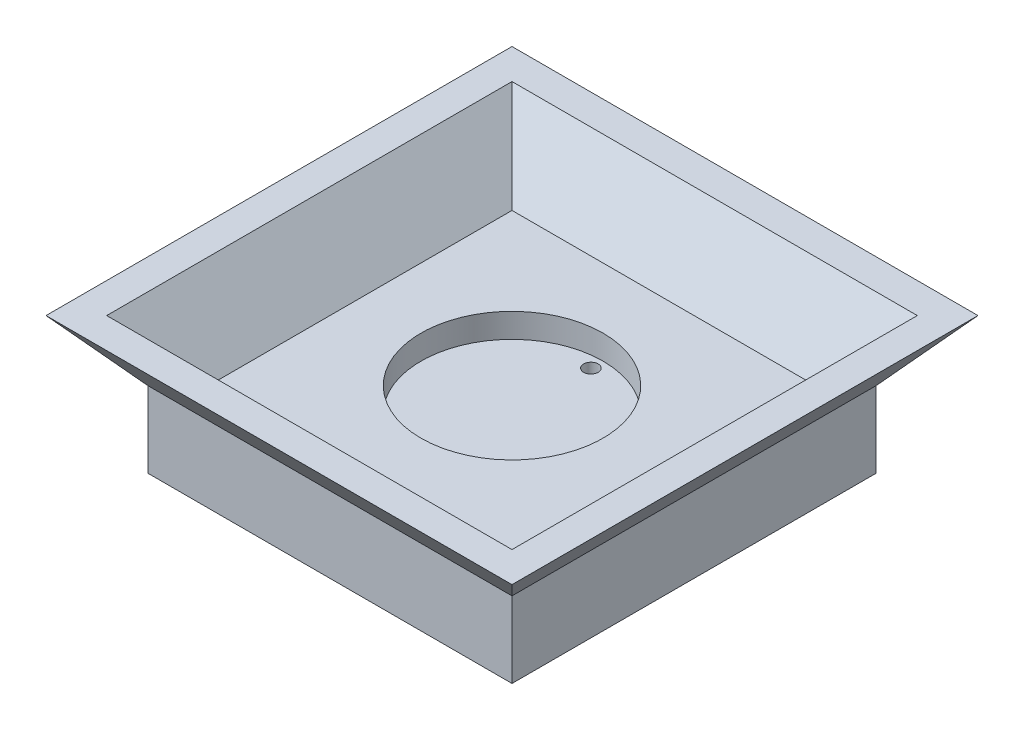
ISO-10303-21;
HEADER;
FILE_DESCRIPTION(('STEP AP214'),'2;1');
FILE_NAME('part.step','',(''),(''),'','','');
FILE_SCHEMA(('AUTOMOTIVE_DESIGN { 1 0 10303 214 1 1 1 1 }'));
ENDSEC;
DATA;
#1=APPLICATION_CONTEXT('core data for automotive mechanical design processes');
#2=APPLICATION_PROTOCOL_DEFINITION('international standard','automotive_design',2000,#1);
#3=PRODUCT_CONTEXT('',#1,'mechanical');
#4=PRODUCT('Part','Part','',(#3));
#5=PRODUCT_RELATED_PRODUCT_CATEGORY('part','',(#4));
#6=PRODUCT_DEFINITION_FORMATION('','',#4);
#7=PRODUCT_DEFINITION_CONTEXT('part definition',#1,'design');
#8=PRODUCT_DEFINITION('design','',#6,#7);
#9=PRODUCT_DEFINITION_SHAPE('','',#8);
#10=(LENGTH_UNIT() NAMED_UNIT(*) SI_UNIT(.MILLI.,.METRE.));
#11=(NAMED_UNIT(*) PLANE_ANGLE_UNIT() SI_UNIT($,.RADIAN.));
#12=(NAMED_UNIT(*) SI_UNIT($,.STERADIAN.) SOLID_ANGLE_UNIT());
#13=UNCERTAINTY_MEASURE_WITH_UNIT(LENGTH_MEASURE(1.E-05),#10,'distance_accuracy_value','');
#14=(GEOMETRIC_REPRESENTATION_CONTEXT(3) GLOBAL_UNCERTAINTY_ASSIGNED_CONTEXT((#13)) GLOBAL_UNIT_ASSIGNED_CONTEXT((#10,
#11,#12)) REPRESENTATION_CONTEXT('',''));
#15=CARTESIAN_POINT('',(0.,0.,0.));
#16=DIRECTION('',(0.,0.,1.));
#17=DIRECTION('',(1.,0.,0.));
#18=AXIS2_PLACEMENT_3D('',#15,#16,#17);
#19=CARTESIAN_POINT('',(38.1,15.875,38.1));
#20=DIRECTION('',(-1.,0.,0.));
#21=DIRECTION('',(0.,0.,1.));
#22=AXIS2_PLACEMENT_3D('',#19,#20,#21);
#23=PLANE('',#22);
#24=DIRECTION('',(0.,-1.,0.));
#25=VECTOR('',#24,1.);
#26=CARTESIAN_POINT('',(38.1,15.875,38.1));
#27=LINE('',#26,#25);
#28=CARTESIAN_POINT('',(38.1,15.875,38.1));
#29=VERTEX_POINT('',#28);
#30=CARTESIAN_POINT('',(38.1,0.,38.1));
#31=VERTEX_POINT('',#30);
#32=EDGE_CURVE('E130',#29,#31,#27,.T.);
#33=ORIENTED_EDGE('',*,*,#32,.T.);
#34=DIRECTION('',(0.,0.,1.));
#35=VECTOR('',#34,1.);
#36=CARTESIAN_POINT('',(38.1,0.,0.));
#37=LINE('',#36,#35);
#38=CARTESIAN_POINT('',(38.1,0.,-38.1));
#39=VERTEX_POINT('',#38);
#40=EDGE_CURVE('E47',#39,#31,#37,.T.);
#41=ORIENTED_EDGE('',*,*,#40,.F.);
#42=DIRECTION('',(0.,-1.,0.));
#43=VECTOR('',#42,1.);
#44=CARTESIAN_POINT('',(38.1,15.875,-38.1));
#45=LINE('',#44,#43);
#46=CARTESIAN_POINT('',(38.1,15.875,-38.1));
#47=VERTEX_POINT('',#46);
#48=EDGE_CURVE('E11',#47,#39,#45,.T.);
#49=ORIENTED_EDGE('',*,*,#48,.F.);
#50=DIRECTION('',(0.,0.,-1.));
#51=VECTOR('',#50,1.);
#52=CARTESIAN_POINT('',(38.1,15.875,38.1));
#53=LINE('',#52,#51);
#54=EDGE_CURVE('E141',#29,#47,#53,.T.);
#55=ORIENTED_EDGE('',*,*,#54,.F.);
#56=EDGE_LOOP('',(#33,#41,#49,#55));
#57=FACE_BOUND('',#56,.T.);
#58=ADVANCED_FACE('F33',(#57),#23,.F.);
#59=CARTESIAN_POINT('',(-38.1,15.875,-38.1));
#60=DIRECTION('',(0.,0.,1.));
#61=DIRECTION('',(1.,0.,0.));
#62=AXIS2_PLACEMENT_3D('',#59,#60,#61);
#63=PLANE('',#62);
#64=ORIENTED_EDGE('',*,*,#48,.T.);
#65=DIRECTION('',(1.,0.,0.));
#66=VECTOR('',#65,1.);
#67=CARTESIAN_POINT('',(0.,0.,-38.1));
#68=LINE('',#67,#66);
#69=CARTESIAN_POINT('',(-38.1,0.,-38.1));
#70=VERTEX_POINT('',#69);
#71=EDGE_CURVE('E124',#70,#39,#68,.T.);
#72=ORIENTED_EDGE('',*,*,#71,.F.);
#73=DIRECTION('',(0.,-1.,0.));
#74=VECTOR('',#73,1.);
#75=CARTESIAN_POINT('',(-38.1,15.875,-38.1));
#76=LINE('',#75,#74);
#77=CARTESIAN_POINT('',(-38.1,15.875,-38.1));
#78=VERTEX_POINT('',#77);
#79=EDGE_CURVE('E40',#78,#70,#76,.T.);
#80=ORIENTED_EDGE('',*,*,#79,.F.);
#81=DIRECTION('',(-1.,0.,0.));
#82=VECTOR('',#81,1.);
#83=CARTESIAN_POINT('',(-38.1,15.875,-38.1));
#84=LINE('',#83,#82);
#85=EDGE_CURVE('E138',#47,#78,#84,.T.);
#86=ORIENTED_EDGE('',*,*,#85,.F.);
#87=EDGE_LOOP('',(#64,#72,#80,#86));
#88=FACE_BOUND('',#87,.T.);
#89=ADVANCED_FACE('F266',(#88),#63,.F.);
#90=CARTESIAN_POINT('',(-38.1,15.875,38.1));
#91=DIRECTION('',(1.,0.,0.));
#92=DIRECTION('',(0.,0.,-1.));
#93=AXIS2_PLACEMENT_3D('',#90,#91,#92);
#94=PLANE('',#93);
#95=ORIENTED_EDGE('',*,*,#79,.T.);
#96=DIRECTION('',(0.,0.,-1.));
#97=VECTOR('',#96,1.);
#98=CARTESIAN_POINT('',(-38.1,0.,0.));
#99=LINE('',#98,#97);
#100=CARTESIAN_POINT('',(-38.1,0.,38.1));
#101=VERTEX_POINT('',#100);
#102=EDGE_CURVE('E110',#101,#70,#99,.T.);
#103=ORIENTED_EDGE('',*,*,#102,.F.);
#104=DIRECTION('',(0.,-1.,0.));
#105=VECTOR('',#104,1.);
#106=CARTESIAN_POINT('',(-38.1,15.875,38.1));
#107=LINE('',#106,#105);
#108=CARTESIAN_POINT('',(-38.1,15.875,38.1));
#109=VERTEX_POINT('',#108);
#110=EDGE_CURVE('E122',#109,#101,#107,.T.);
#111=ORIENTED_EDGE('',*,*,#110,.F.);
#112=DIRECTION('',(0.,0.,1.));
#113=VECTOR('',#112,1.);
#114=CARTESIAN_POINT('',(-38.1,15.875,38.1));
#115=LINE('',#114,#113);
#116=EDGE_CURVE('E135',#78,#109,#115,.T.);
#117=ORIENTED_EDGE('',*,*,#116,.F.);
#118=EDGE_LOOP('',(#95,#103,#111,#117));
#119=FACE_BOUND('',#118,.T.);
#120=ADVANCED_FACE('F120',(#119),#94,.F.);
#121=CARTESIAN_POINT('',(-38.1,15.875,38.1));
#122=DIRECTION('',(0.,0.,-1.));
#123=DIRECTION('',(-1.,0.,0.));
#124=AXIS2_PLACEMENT_3D('',#121,#122,#123);
#125=PLANE('',#124);
#126=ORIENTED_EDGE('',*,*,#110,.T.);
#127=DIRECTION('',(-1.,0.,0.));
#128=VECTOR('',#127,1.);
#129=CARTESIAN_POINT('',(0.,0.,38.1));
#130=LINE('',#129,#128);
#131=EDGE_CURVE('E106',#31,#101,#130,.T.);
#132=ORIENTED_EDGE('',*,*,#131,.F.);
#133=ORIENTED_EDGE('',*,*,#32,.F.);
#134=DIRECTION('',(1.,0.,0.));
#135=VECTOR('',#134,1.);
#136=CARTESIAN_POINT('',(-38.1,15.875,38.1));
#137=LINE('',#136,#135);
#138=EDGE_CURVE('E128',#109,#29,#137,.T.);
#139=ORIENTED_EDGE('',*,*,#138,.F.);
#140=EDGE_LOOP('',(#126,#132,#133,#139));
#141=FACE_BOUND('',#140,.T.);
#142=ADVANCED_FACE('F126',(#141),#125,.F.);
#143=CARTESIAN_POINT('',(-38.1,15.875,-38.1));
#144=DIRECTION('',(-0.766044443118977,-0.64278760968654,0.));
#145=DIRECTION('',(0.642787609686541,-0.766044443118977,0.));
#146=AXIS2_PLACEMENT_3D('',#143,#144,#145);
#147=PLANE('',#146);
#148=ORIENTED_EDGE('',*,*,#116,.T.);
#149=DIRECTION('',(0.540716203060937,-0.644400477571771,-0.540716203060937));
#150=VECTOR('',#149,1.);
#151=CARTESIAN_POINT('',(-38.1,15.875,38.1));
#152=LINE('',#151,#150);
#153=CARTESIAN_POINT('',(-48.7565653159515,28.575,48.7565653159515));
#154=VERTEX_POINT('',#153);
#155=EDGE_CURVE('E144',#154,#109,#152,.T.);
#156=ORIENTED_EDGE('',*,*,#155,.F.);
#157=DIRECTION('',(0.,0.,-1.));
#158=VECTOR('',#157,1.);
#159=CARTESIAN_POINT('',(-48.7565653159515,28.575,-38.1));
#160=LINE('',#159,#158);
#161=CARTESIAN_POINT('',(-48.7565653159515,28.575,-48.7565653159515));
#162=VERTEX_POINT('',#161);
#163=EDGE_CURVE('E152',#162,#154,#160,.F.);
#164=ORIENTED_EDGE('',*,*,#163,.F.);
#165=DIRECTION('',(0.540716203060937,-0.644400477571771,0.540716203060937));
#166=VECTOR('',#165,1.);
#167=CARTESIAN_POINT('',(-38.1,15.875,-38.1));
#168=LINE('',#167,#166);
#169=EDGE_CURVE('E147',#162,#78,#168,.T.);
#170=ORIENTED_EDGE('',*,*,#169,.T.);
#171=EDGE_LOOP('',(#148,#156,#164,#170));
#172=FACE_BOUND('',#171,.T.);
#173=ADVANCED_FACE('F256',(#172),#147,.T.);
#174=CARTESIAN_POINT('',(-38.1,15.875,38.1));
#175=DIRECTION('',(0.,-0.64278760968654,0.766044443118977));
#176=DIRECTION('',(0.,-0.766044443118977,-0.64278760968654));
#177=AXIS2_PLACEMENT_3D('',#174,#175,#176);
#178=PLANE('',#177);
#179=ORIENTED_EDGE('',*,*,#138,.T.);
#180=DIRECTION('',(-0.540716203060937,-0.644400477571771,-0.540716203060937));
#181=VECTOR('',#180,1.);
#182=CARTESIAN_POINT('',(15.821100266349,-10.6759587966246,15.8211002663491));
#183=LINE('',#182,#181);
#184=CARTESIAN_POINT('',(48.7565653159515,28.575,48.7565653159515));
#185=VERTEX_POINT('',#184);
#186=EDGE_CURVE('E156',#185,#29,#183,.T.);
#187=ORIENTED_EDGE('',*,*,#186,.F.);
#188=DIRECTION('',(-1.,0.,0.));
#189=VECTOR('',#188,1.);
#190=CARTESIAN_POINT('',(-38.1,28.575,48.7565653159515));
#191=LINE('',#190,#189);
#192=EDGE_CURVE('E150',#154,#185,#191,.F.);
#193=ORIENTED_EDGE('',*,*,#192,.F.);
#194=ORIENTED_EDGE('',*,*,#155,.T.);
#195=EDGE_LOOP('',(#179,#187,#193,#194));
#196=FACE_BOUND('',#195,.T.);
#197=ADVANCED_FACE('F258',(#196),#178,.T.);
#198=CARTESIAN_POINT('',(38.1,15.875,-38.1));
#199=DIRECTION('',(0.766044443118977,-0.64278760968654,0.));
#200=DIRECTION('',(0.642787609686541,0.766044443118977,0.));
#201=AXIS2_PLACEMENT_3D('',#198,#199,#200);
#202=PLANE('',#201);
#203=ORIENTED_EDGE('',*,*,#54,.T.);
#204=DIRECTION('',(-0.540716203060937,-0.644400477571771,0.540716203060937));
#205=VECTOR('',#204,1.);
#206=CARTESIAN_POINT('',(15.821100266349,-10.6759587966246,-15.8211002663491));
#207=LINE('',#206,#205);
#208=CARTESIAN_POINT('',(48.7565653159515,28.575,-48.7565653159515));
#209=VERTEX_POINT('',#208);
#210=EDGE_CURVE('E159',#209,#47,#207,.T.);
#211=ORIENTED_EDGE('',*,*,#210,.F.);
#212=DIRECTION('',(0.,0.,1.));
#213=VECTOR('',#212,1.);
#214=CARTESIAN_POINT('',(48.7565653159515,28.575,-38.1));
#215=LINE('',#214,#213);
#216=EDGE_CURVE('E148',#185,#209,#215,.F.);
#217=ORIENTED_EDGE('',*,*,#216,.F.);
#218=ORIENTED_EDGE('',*,*,#186,.T.);
#219=EDGE_LOOP('',(#203,#211,#217,#218));
#220=FACE_BOUND('',#219,.T.);
#221=ADVANCED_FACE('F262',(#220),#202,.T.);
#222=CARTESIAN_POINT('',(-38.1,15.875,-38.1));
#223=DIRECTION('',(0.,-0.64278760968654,-0.766044443118977));
#224=DIRECTION('',(0.,0.766044443118977,-0.64278760968654));
#225=AXIS2_PLACEMENT_3D('',#222,#223,#224);
#226=PLANE('',#225);
#227=ORIENTED_EDGE('',*,*,#85,.T.);
#228=ORIENTED_EDGE('',*,*,#169,.F.);
#229=DIRECTION('',(1.,0.,0.));
#230=VECTOR('',#229,1.);
#231=CARTESIAN_POINT('',(-38.1,28.575,-48.7565653159515));
#232=LINE('',#231,#230);
#233=EDGE_CURVE('E145',#209,#162,#232,.F.);
#234=ORIENTED_EDGE('',*,*,#233,.F.);
#235=ORIENTED_EDGE('',*,*,#210,.T.);
#236=EDGE_LOOP('',(#227,#228,#234,#235));
#237=FACE_BOUND('',#236,.T.);
#238=ADVANCED_FACE('F248',(#237),#226,.T.);
#239=CARTESIAN_POINT('',(0.,28.575,0.));
#240=DIRECTION('',(0.,1.,0.));
#241=DIRECTION('',(0.,0.,1.));
#242=AXIS2_PLACEMENT_3D('',#239,#240,#241);
#243=PLANE('',#242);
#244=DIRECTION('',(0.,0.,1.));
#245=VECTOR('',#244,1.);
#246=CARTESIAN_POINT('',(-42.4065653159515,28.575,42.4065653159515));
#247=LINE('',#246,#245);
#248=CARTESIAN_POINT('',(-42.4065653159515,28.575,-42.4065653159515));
#249=VERTEX_POINT('',#248);
#250=CARTESIAN_POINT('',(-42.4065653159515,28.575,42.4065653159515));
#251=VERTEX_POINT('',#250);
#252=EDGE_CURVE('E55',#249,#251,#247,.T.);
#253=ORIENTED_EDGE('',*,*,#252,.F.);
#254=DIRECTION('',(-1.,0.,0.));
#255=VECTOR('',#254,1.);
#256=CARTESIAN_POINT('',(42.4065653159515,28.575,-42.4065653159515));
#257=LINE('',#256,#255);
#258=CARTESIAN_POINT('',(42.4065653159515,28.575,-42.4065653159515));
#259=VERTEX_POINT('',#258);
#260=EDGE_CURVE('E178',#259,#249,#257,.T.);
#261=ORIENTED_EDGE('',*,*,#260,.F.);
#262=DIRECTION('',(0.,0.,-1.));
#263=VECTOR('',#262,1.);
#264=CARTESIAN_POINT('',(42.4065653159515,28.575,42.4065653159515));
#265=LINE('',#264,#263);
#266=CARTESIAN_POINT('',(42.4065653159515,28.575,42.4065653159515));
#267=VERTEX_POINT('',#266);
#268=EDGE_CURVE('E187',#267,#259,#265,.T.);
#269=ORIENTED_EDGE('',*,*,#268,.F.);
#270=DIRECTION('',(1.,0.,0.));
#271=VECTOR('',#270,1.);
#272=CARTESIAN_POINT('',(42.4065653159515,28.575,42.4065653159515));
#273=LINE('',#272,#271);
#274=EDGE_CURVE('E190',#251,#267,#273,.T.);
#275=ORIENTED_EDGE('',*,*,#274,.F.);
#276=EDGE_LOOP('',(#253,#261,#269,#275));
#277=FACE_BOUND('',#276,.T.);
#278=ORIENTED_EDGE('',*,*,#163,.T.);
#279=ORIENTED_EDGE('',*,*,#192,.T.);
#280=ORIENTED_EDGE('',*,*,#216,.T.);
#281=ORIENTED_EDGE('',*,*,#233,.T.);
#282=EDGE_LOOP('',(#278,#279,#280,#281));
#283=FACE_BOUND('',#282,.T.);
#284=ADVANCED_FACE('F245',(#277,#283),#243,.T.);
#285=CARTESIAN_POINT('',(-42.4065653159515,28.575,42.4065653159515));
#286=DIRECTION('',(-0.766044443118977,-0.64278760968654,0.));
#287=DIRECTION('',(0.64278760968654,-0.766044443118977,0.));
#288=AXIS2_PLACEMENT_3D('',#285,#286,#287);
#289=PLANE('',#288);
#290=ORIENTED_EDGE('',*,*,#252,.T.);
#291=DIRECTION('',(-0.540716203060937,0.644400477571771,0.540716203060937));
#292=VECTOR('',#291,1.);
#293=CARTESIAN_POINT('',(-42.4065653159515,28.575,42.4065653159515));
#294=LINE('',#293,#292);
#295=CARTESIAN_POINT('',(-31.75,15.875,31.75));
#296=VERTEX_POINT('',#295);
#297=EDGE_CURVE('E175',#296,#251,#294,.T.);
#298=ORIENTED_EDGE('',*,*,#297,.F.);
#299=DIRECTION('',(0.,0.,1.));
#300=VECTOR('',#299,1.);
#301=CARTESIAN_POINT('',(-31.75,15.875,0.));
#302=LINE('',#301,#300);
#303=CARTESIAN_POINT('',(-31.75,15.875,-31.75));
#304=VERTEX_POINT('',#303);
#305=EDGE_CURVE('E169',#304,#296,#302,.T.);
#306=ORIENTED_EDGE('',*,*,#305,.F.);
#307=DIRECTION('',(-0.540716203060937,0.644400477571771,-0.540716203060937));
#308=VECTOR('',#307,1.);
#309=CARTESIAN_POINT('',(-17.609410021395,-0.977098908404153,-17.609410021395));
#310=LINE('',#309,#308);
#311=EDGE_CURVE('E155',#304,#249,#310,.T.);
#312=ORIENTED_EDGE('',*,*,#311,.T.);
#313=EDGE_LOOP('',(#290,#298,#306,#312));
#314=FACE_BOUND('',#313,.T.);
#315=ADVANCED_FACE('F234',(#314),#289,.F.);
#316=CARTESIAN_POINT('',(42.4065653159515,28.575,-42.4065653159515));
#317=DIRECTION('',(0.,-0.64278760968654,-0.766044443118977));
#318=DIRECTION('',(0.,0.766044443118977,-0.64278760968654));
#319=AXIS2_PLACEMENT_3D('',#316,#317,#318);
#320=PLANE('',#319);
#321=ORIENTED_EDGE('',*,*,#260,.T.);
#322=ORIENTED_EDGE('',*,*,#311,.F.);
#323=DIRECTION('',(-1.,0.,0.));
#324=VECTOR('',#323,1.);
#325=CARTESIAN_POINT('',(0.,15.875,-31.75));
#326=LINE('',#325,#324);
#327=CARTESIAN_POINT('',(31.75,15.875,-31.75));
#328=VERTEX_POINT('',#327);
#329=EDGE_CURVE('E172',#328,#304,#326,.T.);
#330=ORIENTED_EDGE('',*,*,#329,.F.);
#331=DIRECTION('',(0.540716203060937,0.644400477571771,-0.540716203060937));
#332=VECTOR('',#331,1.);
#333=CARTESIAN_POINT('',(17.609410021395,-0.97709890840416,-17.609410021395));
#334=LINE('',#333,#332);
#335=EDGE_CURVE('E179',#328,#259,#334,.T.);
#336=ORIENTED_EDGE('',*,*,#335,.T.);
#337=EDGE_LOOP('',(#321,#322,#330,#336));
#338=FACE_BOUND('',#337,.T.);
#339=ADVANCED_FACE('F242',(#338),#320,.F.);
#340=CARTESIAN_POINT('',(42.4065653159515,28.575,42.4065653159515));
#341=DIRECTION('',(0.766044443118977,-0.64278760968654,0.));
#342=DIRECTION('',(0.64278760968654,0.766044443118977,0.));
#343=AXIS2_PLACEMENT_3D('',#340,#341,#342);
#344=PLANE('',#343);
#345=ORIENTED_EDGE('',*,*,#268,.T.);
#346=ORIENTED_EDGE('',*,*,#335,.F.);
#347=DIRECTION('',(0.,0.,-1.));
#348=VECTOR('',#347,1.);
#349=CARTESIAN_POINT('',(31.75,15.875,0.));
#350=LINE('',#349,#348);
#351=CARTESIAN_POINT('',(31.75,15.875,31.75));
#352=VERTEX_POINT('',#351);
#353=EDGE_CURVE('E168',#352,#328,#350,.T.);
#354=ORIENTED_EDGE('',*,*,#353,.F.);
#355=DIRECTION('',(0.540716203060937,0.644400477571771,0.540716203060937));
#356=VECTOR('',#355,1.);
#357=CARTESIAN_POINT('',(42.4065653159515,28.575,42.4065653159515));
#358=LINE('',#357,#356);
#359=EDGE_CURVE('E181',#352,#267,#358,.T.);
#360=ORIENTED_EDGE('',*,*,#359,.T.);
#361=EDGE_LOOP('',(#345,#346,#354,#360));
#362=FACE_BOUND('',#361,.T.);
#363=ADVANCED_FACE('F240',(#362),#344,.F.);
#364=CARTESIAN_POINT('',(42.4065653159515,28.575,42.4065653159515));
#365=DIRECTION('',(0.,-0.64278760968654,0.766044443118977));
#366=DIRECTION('',(0.,-0.766044443118977,-0.64278760968654));
#367=AXIS2_PLACEMENT_3D('',#364,#365,#366);
#368=PLANE('',#367);
#369=ORIENTED_EDGE('',*,*,#274,.T.);
#370=ORIENTED_EDGE('',*,*,#359,.F.);
#371=DIRECTION('',(1.,0.,0.));
#372=VECTOR('',#371,1.);
#373=CARTESIAN_POINT('',(0.,15.875,31.75));
#374=LINE('',#373,#372);
#375=EDGE_CURVE('E165',#296,#352,#374,.T.);
#376=ORIENTED_EDGE('',*,*,#375,.F.);
#377=ORIENTED_EDGE('',*,*,#297,.T.);
#378=EDGE_LOOP('',(#369,#370,#376,#377));
#379=FACE_BOUND('',#378,.T.);
#380=ADVANCED_FACE('F229',(#379),#368,.F.);
#381=CARTESIAN_POINT('',(0.,15.875,0.));
#382=DIRECTION('',(0.,1.,0.));
#383=DIRECTION('',(0.,0.,1.));
#384=AXIS2_PLACEMENT_3D('',#381,#382,#383);
#385=PLANE('',#384);
#386=CARTESIAN_POINT('',(0.,15.875,0.));
#387=DIRECTION('',(0.,1.,0.));
#388=DIRECTION('',(0.,0.,1.));
#389=AXIS2_PLACEMENT_3D('',#386,#387,#388);
#390=CIRCLE('',#389,19.05);
#391=CARTESIAN_POINT('',(0.,15.875,19.05));
#392=VERTEX_POINT('',#391);
#393=EDGE_CURVE('E195',#392,#392,#390,.T.);
#394=ORIENTED_EDGE('',*,*,#393,.F.);
#395=EDGE_LOOP('',(#394));
#396=FACE_BOUND('',#395,.T.);
#397=ORIENTED_EDGE('',*,*,#305,.T.);
#398=ORIENTED_EDGE('',*,*,#375,.T.);
#399=ORIENTED_EDGE('',*,*,#353,.T.);
#400=ORIENTED_EDGE('',*,*,#329,.T.);
#401=EDGE_LOOP('',(#397,#398,#399,#400));
#402=FACE_BOUND('',#401,.T.);
#403=ADVANCED_FACE('F223',(#396,#402),#385,.T.);
#404=CARTESIAN_POINT('',(0.,10.795,0.));
#405=DIRECTION('',(0.,1.,0.));
#406=DIRECTION('',(0.,0.,1.));
#407=AXIS2_PLACEMENT_3D('',#404,#405,#406);
#408=CYLINDRICAL_SURFACE('',#407,19.05);
#409=CARTESIAN_POINT('',(0.,10.795,0.));
#410=DIRECTION('',(0.,1.,0.));
#411=DIRECTION('',(0.,0.,1.));
#412=AXIS2_PLACEMENT_3D('',#409,#410,#411);
#413=CIRCLE('',#412,19.05);
#414=CARTESIAN_POINT('',(0.,10.795,19.05));
#415=VERTEX_POINT('',#414);
#416=EDGE_CURVE('E194',#415,#415,#413,.T.);
#417=ORIENTED_EDGE('',*,*,#416,.F.);
#418=EDGE_LOOP('',(#417));
#419=FACE_BOUND('',#418,.T.);
#420=ORIENTED_EDGE('',*,*,#393,.T.);
#421=EDGE_LOOP('',(#420));
#422=FACE_BOUND('',#421,.T.);
#423=ADVANCED_FACE('F217',(#419,#422),#408,.F.);
#424=CARTESIAN_POINT('',(0.,10.795,0.));
#425=DIRECTION('',(0.,1.,0.));
#426=DIRECTION('',(0.,0.,1.));
#427=AXIS2_PLACEMENT_3D('',#424,#425,#426);
#428=PLANE('',#427);
#429=CARTESIAN_POINT('',(0.,10.795,-16.51));
#430=DIRECTION('',(0.,1.,0.));
#431=DIRECTION('',(0.,0.,1.));
#432=AXIS2_PLACEMENT_3D('',#429,#430,#431);
#433=CIRCLE('',#432,1.524);
#434=CARTESIAN_POINT('',(0.,10.795,-14.986));
#435=VERTEX_POINT('',#434);
#436=EDGE_CURVE('E198',#435,#435,#433,.T.);
#437=ORIENTED_EDGE('',*,*,#436,.F.);
#438=EDGE_LOOP('',(#437));
#439=FACE_BOUND('',#438,.T.);
#440=ORIENTED_EDGE('',*,*,#416,.T.);
#441=EDGE_LOOP('',(#440));
#442=FACE_BOUND('',#441,.T.);
#443=ADVANCED_FACE('F211',(#439,#442),#428,.T.);
#444=CARTESIAN_POINT('',(0.,-9.525,-16.51));
#445=DIRECTION('',(0.,1.,0.));
#446=DIRECTION('',(0.,0.,1.));
#447=AXIS2_PLACEMENT_3D('',#444,#445,#446);
#448=CYLINDRICAL_SURFACE('',#447,1.524);
#449=CARTESIAN_POINT('',(0.,0.,-16.51));
#450=DIRECTION('',(0.,1.,0.));
#451=DIRECTION('',(0.,0.,1.));
#452=AXIS2_PLACEMENT_3D('',#449,#450,#451);
#453=CIRCLE('',#452,1.524);
#454=CARTESIAN_POINT('',(0.,0.,-14.986));
#455=VERTEX_POINT('',#454);
#456=EDGE_CURVE('E116',#455,#455,#453,.T.);
#457=ORIENTED_EDGE('',*,*,#456,.F.);
#458=EDGE_LOOP('',(#457));
#459=FACE_BOUND('',#458,.T.);
#460=ORIENTED_EDGE('',*,*,#436,.T.);
#461=EDGE_LOOP('',(#460));
#462=FACE_BOUND('',#461,.T.);
#463=ADVANCED_FACE('F208',(#459,#462),#448,.F.);
#464=CARTESIAN_POINT('',(0.,0.,0.));
#465=DIRECTION('',(0.,1.,0.));
#466=DIRECTION('',(0.,0.,1.));
#467=AXIS2_PLACEMENT_3D('',#464,#465,#466);
#468=PLANE('',#467);
#469=ORIENTED_EDGE('',*,*,#40,.T.);
#470=ORIENTED_EDGE('',*,*,#131,.T.);
#471=ORIENTED_EDGE('',*,*,#102,.T.);
#472=ORIENTED_EDGE('',*,*,#71,.T.);
#473=EDGE_LOOP('',(#469,#470,#471,#472));
#474=FACE_BOUND('',#473,.T.);
#475=ORIENTED_EDGE('',*,*,#456,.T.);
#476=EDGE_LOOP('',(#475));
#477=FACE_BOUND('',#476,.T.);
#478=ADVANCED_FACE('F108',(#474,#477),#468,.F.);
#479=CLOSED_SHELL('',(#58,#89,#120,#142,#173,#197,#221,#238,#284,#315,#339,#363,#380,#403,#423,
#443,#463,#478));
#480=MANIFOLD_SOLID_BREP('B2',#479);
#481=ADVANCED_BREP_SHAPE_REPRESENTATION('',(#18,#480),#14);
#482=SHAPE_DEFINITION_REPRESENTATION(#9,#481);
ENDSEC;
END-ISO-10303-21;
